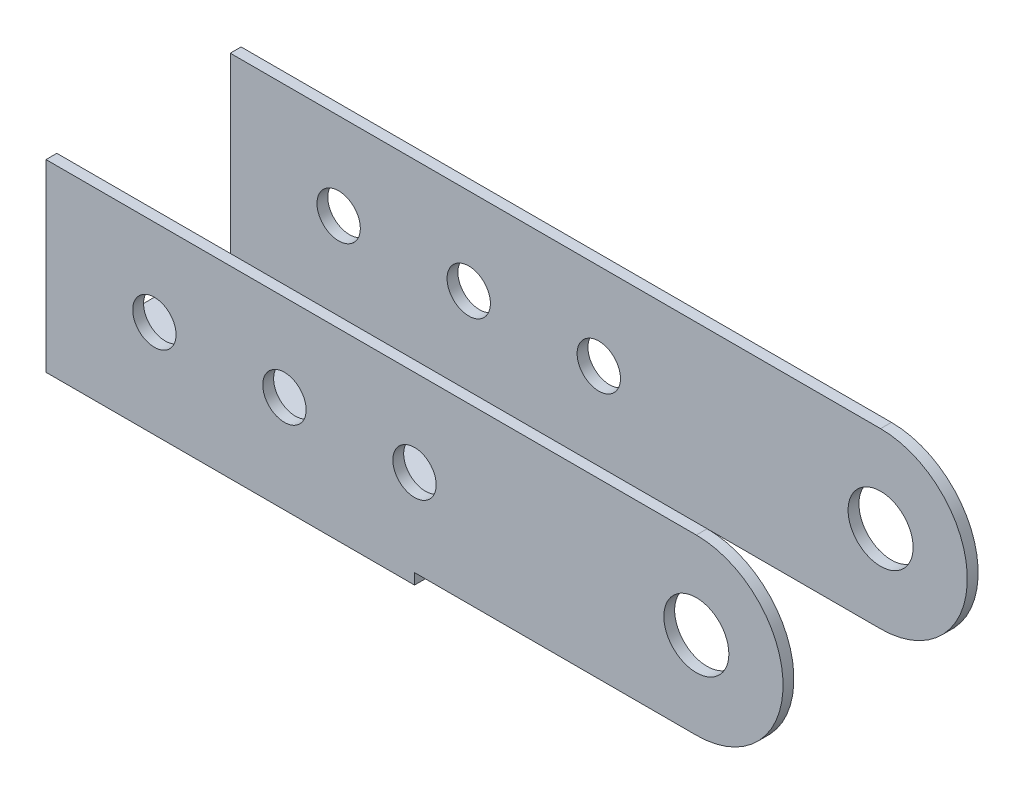
ISO-10303-21;
HEADER;
FILE_DESCRIPTION(('STEP AP214'),'2;1');
FILE_NAME('part.step','',(''),(''),'','','');
FILE_SCHEMA(('AUTOMOTIVE_DESIGN { 1 0 10303 214 1 1 1 1 }'));
ENDSEC;
DATA;
#1=APPLICATION_CONTEXT('core data for automotive mechanical design processes');
#2=APPLICATION_PROTOCOL_DEFINITION('international standard','automotive_design',2000,#1);
#3=PRODUCT_CONTEXT('',#1,'mechanical');
#4=PRODUCT('Part','Part','',(#3));
#5=PRODUCT_RELATED_PRODUCT_CATEGORY('part','',(#4));
#6=PRODUCT_DEFINITION_FORMATION('','',#4);
#7=PRODUCT_DEFINITION_CONTEXT('part definition',#1,'design');
#8=PRODUCT_DEFINITION('design','',#6,#7);
#9=PRODUCT_DEFINITION_SHAPE('','',#8);
#10=(LENGTH_UNIT() NAMED_UNIT(*) SI_UNIT(.MILLI.,.METRE.));
#11=(NAMED_UNIT(*) PLANE_ANGLE_UNIT() SI_UNIT($,.RADIAN.));
#12=(NAMED_UNIT(*) SI_UNIT($,.STERADIAN.) SOLID_ANGLE_UNIT());
#13=UNCERTAINTY_MEASURE_WITH_UNIT(LENGTH_MEASURE(1.E-05),#10,'distance_accuracy_value','');
#14=(GEOMETRIC_REPRESENTATION_CONTEXT(3) GLOBAL_UNCERTAINTY_ASSIGNED_CONTEXT((#13)) GLOBAL_UNIT_ASSIGNED_CONTEXT((#10,
#11,#12)) REPRESENTATION_CONTEXT('',''));
#15=CARTESIAN_POINT('',(0.,0.,0.));
#16=DIRECTION('',(0.,0.,1.));
#17=DIRECTION('',(1.,0.,0.));
#18=AXIS2_PLACEMENT_3D('',#15,#16,#17);
#19=CARTESIAN_POINT('',(-15.,-4.,8.5));
#20=DIRECTION('',(0.,1.,0.));
#21=DIRECTION('',(-1.,0.,0.));
#22=AXIS2_PLACEMENT_3D('',#19,#20,#21);
#23=PLANE('',#22);
#24=DIRECTION('',(0.,0.,1.));
#25=VECTOR('',#24,1.);
#26=CARTESIAN_POINT('',(2.00000000000001,-4.,8.5));
#27=LINE('',#26,#25);
#28=CARTESIAN_POINT('',(2.00000000000001,-4.,8.));
#29=VERTEX_POINT('',#28);
#30=CARTESIAN_POINT('',(2.00000000000001,-4.,8.5));
#31=VERTEX_POINT('',#30);
#32=EDGE_CURVE('E11',#29,#31,#27,.T.);
#33=ORIENTED_EDGE('',*,*,#32,.F.);
#34=DIRECTION('',(1.,0.,0.));
#35=VECTOR('',#34,1.);
#36=CARTESIAN_POINT('',(-15.,-4.,8.));
#37=LINE('',#36,#35);
#38=CARTESIAN_POINT('',(15.,-4.,8.));
#39=VERTEX_POINT('',#38);
#40=EDGE_CURVE('E222',#29,#39,#37,.T.);
#41=ORIENTED_EDGE('',*,*,#40,.T.);
#42=DIRECTION('',(0.,0.,-1.));
#43=VECTOR('',#42,1.);
#44=CARTESIAN_POINT('',(15.,-4.,8.5));
#45=LINE('',#44,#43);
#46=CARTESIAN_POINT('',(15.,-4.,8.5));
#47=VERTEX_POINT('',#46);
#48=EDGE_CURVE('E45',#47,#39,#45,.T.);
#49=ORIENTED_EDGE('',*,*,#48,.F.);
#50=DIRECTION('',(1.,0.,0.));
#51=VECTOR('',#50,1.);
#52=CARTESIAN_POINT('',(-15.,-4.,8.5));
#53=LINE('',#52,#51);
#54=EDGE_CURVE('E52',#31,#47,#53,.T.);
#55=ORIENTED_EDGE('',*,*,#54,.F.);
#56=EDGE_LOOP('',(#33,#41,#49,#55));
#57=FACE_BOUND('',#56,.T.);
#58=ADVANCED_FACE('F37',(#57),#23,.F.);
#59=CARTESIAN_POINT('',(15.,0.,8.5));
#60=DIRECTION('',(0.,0.,1.));
#61=DIRECTION('',(1.,0.,0.));
#62=AXIS2_PLACEMENT_3D('',#59,#60,#61);
#63=PLANE('',#62);
#64=CARTESIAN_POINT('',(-3.99999999999999,0.,8.5));
#65=DIRECTION('',(0.,0.,1.));
#66=DIRECTION('',(1.,0.,0.));
#67=AXIS2_PLACEMENT_3D('',#64,#65,#66);
#68=CIRCLE('',#67,1.);
#69=CARTESIAN_POINT('',(-2.99999999999999,0.,8.5));
#70=VERTEX_POINT('',#69);
#71=EDGE_CURVE('E194',#70,#70,#68,.T.);
#72=ORIENTED_EDGE('',*,*,#71,.F.);
#73=EDGE_LOOP('',(#72));
#74=FACE_BOUND('',#73,.T.);
#75=CARTESIAN_POINT('',(15.,0.,8.5));
#76=DIRECTION('',(0.,0.,1.));
#77=DIRECTION('',(1.,0.,0.));
#78=AXIS2_PLACEMENT_3D('',#75,#76,#77);
#79=CIRCLE('',#78,1.5);
#80=CARTESIAN_POINT('',(16.5,0.,8.5));
#81=VERTEX_POINT('',#80);
#82=EDGE_CURVE('E206',#81,#81,#79,.T.);
#83=ORIENTED_EDGE('',*,*,#82,.F.);
#84=EDGE_LOOP('',(#83));
#85=FACE_BOUND('',#84,.T.);
#86=DIRECTION('',(0.,-1.,0.));
#87=VECTOR('',#86,1.);
#88=CARTESIAN_POINT('',(-15.,4.,8.5));
#89=LINE('',#88,#87);
#90=CARTESIAN_POINT('',(-15.,4.,8.5));
#91=VERTEX_POINT('',#90);
#92=CARTESIAN_POINT('',(-15.,-4.5,8.5));
#93=VERTEX_POINT('',#92);
#94=EDGE_CURVE('E212',#91,#93,#89,.T.);
#95=ORIENTED_EDGE('',*,*,#94,.T.);
#96=DIRECTION('',(-1.,0.,0.));
#97=VECTOR('',#96,1.);
#98=CARTESIAN_POINT('',(-15.,-4.5,8.5));
#99=LINE('',#98,#97);
#100=CARTESIAN_POINT('',(2.00000000000001,-4.5,8.5));
#101=VERTEX_POINT('',#100);
#102=EDGE_CURVE('E168',#101,#93,#99,.T.);
#103=ORIENTED_EDGE('',*,*,#102,.F.);
#104=DIRECTION('',(0.,1.,0.));
#105=VECTOR('',#104,1.);
#106=CARTESIAN_POINT('',(2.00000000000001,-4.5,8.5));
#107=LINE('',#106,#105);
#108=EDGE_CURVE('E184',#101,#31,#107,.T.);
#109=ORIENTED_EDGE('',*,*,#108,.T.);
#110=ORIENTED_EDGE('',*,*,#54,.T.);
#111=CARTESIAN_POINT('',(15.,0.,8.5));
#112=DIRECTION('',(0.,0.,1.));
#113=DIRECTION('',(1.,0.,0.));
#114=AXIS2_PLACEMENT_3D('',#111,#112,#113);
#115=CIRCLE('',#114,4.);
#116=CARTESIAN_POINT('',(15.,4.,8.5));
#117=VERTEX_POINT('',#116);
#118=EDGE_CURVE('E216',#47,#117,#115,.T.);
#119=ORIENTED_EDGE('',*,*,#118,.T.);
#120=DIRECTION('',(-1.,0.,0.));
#121=VECTOR('',#120,1.);
#122=CARTESIAN_POINT('',(15.,4.,8.5));
#123=LINE('',#122,#121);
#124=EDGE_CURVE('E218',#117,#91,#123,.T.);
#125=ORIENTED_EDGE('',*,*,#124,.T.);
#126=EDGE_LOOP('',(#95,#103,#109,#110,#119,#125));
#127=FACE_BOUND('',#126,.T.);
#128=CARTESIAN_POINT('',(2.00000000000001,0.,8.5));
#129=DIRECTION('',(0.,0.,1.));
#130=DIRECTION('',(1.,0.,0.));
#131=AXIS2_PLACEMENT_3D('',#128,#129,#130);
#132=CIRCLE('',#131,1.);
#133=CARTESIAN_POINT('',(3.00000000000001,0.,8.5));
#134=VERTEX_POINT('',#133);
#135=EDGE_CURVE('E200',#134,#134,#132,.T.);
#136=ORIENTED_EDGE('',*,*,#135,.F.);
#137=EDGE_LOOP('',(#136));
#138=FACE_BOUND('',#137,.T.);
#139=CARTESIAN_POINT('',(-9.99999999999999,0.,8.5));
#140=DIRECTION('',(0.,0.,1.));
#141=DIRECTION('',(1.,0.,0.));
#142=AXIS2_PLACEMENT_3D('',#139,#140,#141);
#143=CIRCLE('',#142,1.);
#144=CARTESIAN_POINT('',(-9.,0.,8.5));
#145=VERTEX_POINT('',#144);
#146=EDGE_CURVE('E188',#145,#145,#143,.T.);
#147=ORIENTED_EDGE('',*,*,#146,.F.);
#148=EDGE_LOOP('',(#147));
#149=FACE_BOUND('',#148,.T.);
#150=ADVANCED_FACE('F254',(#74,#85,#127,#138,#149),#63,.T.);
#151=CARTESIAN_POINT('',(15.,0.,8.));
#152=DIRECTION('',(0.,0.,1.));
#153=DIRECTION('',(1.,0.,0.));
#154=AXIS2_PLACEMENT_3D('',#151,#152,#153);
#155=PLANE('',#154);
#156=DIRECTION('',(0.,-1.,0.));
#157=VECTOR('',#156,1.);
#158=CARTESIAN_POINT('',(-15.,4.,8.));
#159=LINE('',#158,#157);
#160=CARTESIAN_POINT('',(-15.,4.,8.));
#161=VERTEX_POINT('',#160);
#162=CARTESIAN_POINT('',(-15.,-4.,8.));
#163=VERTEX_POINT('',#162);
#164=EDGE_CURVE('E209',#161,#163,#159,.T.);
#165=ORIENTED_EDGE('',*,*,#164,.F.);
#166=DIRECTION('',(-1.,0.,0.));
#167=VECTOR('',#166,1.);
#168=CARTESIAN_POINT('',(15.,4.,8.));
#169=LINE('',#168,#167);
#170=CARTESIAN_POINT('',(15.,4.,8.));
#171=VERTEX_POINT('',#170);
#172=EDGE_CURVE('E214',#171,#161,#169,.T.);
#173=ORIENTED_EDGE('',*,*,#172,.F.);
#174=CARTESIAN_POINT('',(15.,0.,8.));
#175=DIRECTION('',(0.,0.,1.));
#176=DIRECTION('',(1.,0.,0.));
#177=AXIS2_PLACEMENT_3D('',#174,#175,#176);
#178=CIRCLE('',#177,4.);
#179=EDGE_CURVE('E226',#39,#171,#178,.T.);
#180=ORIENTED_EDGE('',*,*,#179,.F.);
#181=ORIENTED_EDGE('',*,*,#40,.F.);
#182=EDGE_CURVE('E223',#163,#29,#37,.T.);
#183=ORIENTED_EDGE('',*,*,#182,.F.);
#184=EDGE_LOOP('',(#165,#173,#180,#181,#183));
#185=FACE_BOUND('',#184,.T.);
#186=CARTESIAN_POINT('',(15.,0.,8.));
#187=DIRECTION('',(0.,0.,1.));
#188=DIRECTION('',(1.,0.,0.));
#189=AXIS2_PLACEMENT_3D('',#186,#187,#188);
#190=CIRCLE('',#189,1.5);
#191=CARTESIAN_POINT('',(16.5,0.,8.));
#192=VERTEX_POINT('',#191);
#193=EDGE_CURVE('E203',#192,#192,#190,.T.);
#194=ORIENTED_EDGE('',*,*,#193,.T.);
#195=EDGE_LOOP('',(#194));
#196=FACE_BOUND('',#195,.T.);
#197=CARTESIAN_POINT('',(2.00000000000001,0.,8.));
#198=DIRECTION('',(0.,0.,1.));
#199=DIRECTION('',(1.,0.,0.));
#200=AXIS2_PLACEMENT_3D('',#197,#198,#199);
#201=CIRCLE('',#200,1.);
#202=CARTESIAN_POINT('',(3.00000000000001,0.,8.));
#203=VERTEX_POINT('',#202);
#204=EDGE_CURVE('E197',#203,#203,#201,.T.);
#205=ORIENTED_EDGE('',*,*,#204,.T.);
#206=EDGE_LOOP('',(#205));
#207=FACE_BOUND('',#206,.T.);
#208=CARTESIAN_POINT('',(-3.99999999999999,0.,8.));
#209=DIRECTION('',(0.,0.,1.));
#210=DIRECTION('',(1.,0.,0.));
#211=AXIS2_PLACEMENT_3D('',#208,#209,#210);
#212=CIRCLE('',#211,1.);
#213=CARTESIAN_POINT('',(-2.99999999999999,0.,8.));
#214=VERTEX_POINT('',#213);
#215=EDGE_CURVE('E191',#214,#214,#212,.T.);
#216=ORIENTED_EDGE('',*,*,#215,.T.);
#217=EDGE_LOOP('',(#216));
#218=FACE_BOUND('',#217,.T.);
#219=CARTESIAN_POINT('',(-9.99999999999999,0.,8.));
#220=DIRECTION('',(0.,0.,1.));
#221=DIRECTION('',(1.,0.,0.));
#222=AXIS2_PLACEMENT_3D('',#219,#220,#221);
#223=CIRCLE('',#222,1.);
#224=CARTESIAN_POINT('',(-9.,0.,8.));
#225=VERTEX_POINT('',#224);
#226=EDGE_CURVE('E187',#225,#225,#223,.T.);
#227=ORIENTED_EDGE('',*,*,#226,.T.);
#228=EDGE_LOOP('',(#227));
#229=FACE_BOUND('',#228,.T.);
#230=ADVANCED_FACE('F243',(#185,#196,#207,#218,#229),#155,.F.);
#231=CARTESIAN_POINT('',(-15.,4.,8.5));
#232=DIRECTION('',(1.,0.,0.));
#233=DIRECTION('',(0.,0.,-1.));
#234=AXIS2_PLACEMENT_3D('',#231,#232,#233);
#235=PLANE('',#234);
#236=ORIENTED_EDGE('',*,*,#164,.T.);
#237=DIRECTION('',(0.,0.,-1.));
#238=VECTOR('',#237,1.);
#239=CARTESIAN_POINT('',(-15.,-4.,-0.5));
#240=LINE('',#239,#238);
#241=CARTESIAN_POINT('',(-15.,-4.,0.));
#242=VERTEX_POINT('',#241);
#243=EDGE_CURVE('E169',#163,#242,#240,.T.);
#244=ORIENTED_EDGE('',*,*,#243,.T.);
#245=DIRECTION('',(0.,-1.,0.));
#246=VECTOR('',#245,1.);
#247=CARTESIAN_POINT('',(-15.,4.,0.));
#248=LINE('',#247,#246);
#249=CARTESIAN_POINT('',(-15.,4.,0.));
#250=VERTEX_POINT('',#249);
#251=EDGE_CURVE('E161',#250,#242,#248,.T.);
#252=ORIENTED_EDGE('',*,*,#251,.F.);
#253=DIRECTION('',(0.,0.,1.));
#254=VECTOR('',#253,1.);
#255=CARTESIAN_POINT('',(-15.,4.,-0.5));
#256=LINE('',#255,#254);
#257=CARTESIAN_POINT('',(-15.,4.,-0.5));
#258=VERTEX_POINT('',#257);
#259=EDGE_CURVE('E130',#258,#250,#256,.T.);
#260=ORIENTED_EDGE('',*,*,#259,.F.);
#261=DIRECTION('',(0.,1.,0.));
#262=VECTOR('',#261,1.);
#263=CARTESIAN_POINT('',(-15.,-4.5,-0.5));
#264=LINE('',#263,#262);
#265=CARTESIAN_POINT('',(-15.,-4.5,-0.5));
#266=VERTEX_POINT('',#265);
#267=EDGE_CURVE('E140',#266,#258,#264,.T.);
#268=ORIENTED_EDGE('',*,*,#267,.F.);
#269=DIRECTION('',(0.,0.,-1.));
#270=VECTOR('',#269,1.);
#271=CARTESIAN_POINT('',(-15.,-4.5,-0.5));
#272=LINE('',#271,#270);
#273=EDGE_CURVE('E172',#93,#266,#272,.T.);
#274=ORIENTED_EDGE('',*,*,#273,.F.);
#275=ORIENTED_EDGE('',*,*,#94,.F.);
#276=DIRECTION('',(0.,0.,-1.));
#277=VECTOR('',#276,1.);
#278=CARTESIAN_POINT('',(-15.,4.,8.5));
#279=LINE('',#278,#277);
#280=EDGE_CURVE('E220',#91,#161,#279,.T.);
#281=ORIENTED_EDGE('',*,*,#280,.T.);
#282=EDGE_LOOP('',(#236,#244,#252,#260,#268,#274,#275,#281));
#283=FACE_BOUND('',#282,.T.);
#284=ADVANCED_FACE('F39',(#283),#235,.F.);
#285=CARTESIAN_POINT('',(15.,0.,8.5));
#286=DIRECTION('',(0.,0.,-1.));
#287=DIRECTION('',(-1.,0.,0.));
#288=AXIS2_PLACEMENT_3D('',#285,#286,#287);
#289=CYLINDRICAL_SURFACE('',#288,4.);
#290=ORIENTED_EDGE('',*,*,#179,.T.);
#291=DIRECTION('',(0.,0.,-1.));
#292=VECTOR('',#291,1.);
#293=CARTESIAN_POINT('',(15.,4.,8.5));
#294=LINE('',#293,#292);
#295=EDGE_CURVE('E231',#117,#171,#294,.T.);
#296=ORIENTED_EDGE('',*,*,#295,.F.);
#297=ORIENTED_EDGE('',*,*,#118,.F.);
#298=ORIENTED_EDGE('',*,*,#48,.T.);
#299=EDGE_LOOP('',(#290,#296,#297,#298));
#300=FACE_BOUND('',#299,.T.);
#301=ADVANCED_FACE('F237',(#300),#289,.T.);
#302=CARTESIAN_POINT('',(15.,4.,8.5));
#303=DIRECTION('',(0.,-1.,0.));
#304=DIRECTION('',(0.,0.,-1.));
#305=AXIS2_PLACEMENT_3D('',#302,#303,#304);
#306=PLANE('',#305);
#307=ORIENTED_EDGE('',*,*,#172,.T.);
#308=ORIENTED_EDGE('',*,*,#280,.F.);
#309=ORIENTED_EDGE('',*,*,#124,.F.);
#310=ORIENTED_EDGE('',*,*,#295,.T.);
#311=EDGE_LOOP('',(#307,#308,#309,#310));
#312=FACE_BOUND('',#311,.T.);
#313=ADVANCED_FACE('F248',(#312),#306,.F.);
#314=CARTESIAN_POINT('',(15.,0.,8.5));
#315=DIRECTION('',(0.,0.,-1.));
#316=DIRECTION('',(-1.,0.,0.));
#317=AXIS2_PLACEMENT_3D('',#314,#315,#316);
#318=CYLINDRICAL_SURFACE('',#317,1.5);
#319=ORIENTED_EDGE('',*,*,#82,.T.);
#320=EDGE_LOOP('',(#319));
#321=FACE_BOUND('',#320,.T.);
#322=ORIENTED_EDGE('',*,*,#193,.F.);
#323=EDGE_LOOP('',(#322));
#324=FACE_BOUND('',#323,.T.);
#325=ADVANCED_FACE('F273',(#321,#324),#318,.F.);
#326=CARTESIAN_POINT('',(2.00000000000001,0.,8.5));
#327=DIRECTION('',(0.,0.,-1.));
#328=DIRECTION('',(-1.,0.,0.));
#329=AXIS2_PLACEMENT_3D('',#326,#327,#328);
#330=CYLINDRICAL_SURFACE('',#329,1.);
#331=ORIENTED_EDGE('',*,*,#135,.T.);
#332=EDGE_LOOP('',(#331));
#333=FACE_BOUND('',#332,.T.);
#334=ORIENTED_EDGE('',*,*,#204,.F.);
#335=EDGE_LOOP('',(#334));
#336=FACE_BOUND('',#335,.T.);
#337=ADVANCED_FACE('F278',(#333,#336),#330,.F.);
#338=CARTESIAN_POINT('',(-3.99999999999999,0.,8.5));
#339=DIRECTION('',(0.,0.,-1.));
#340=DIRECTION('',(-1.,0.,0.));
#341=AXIS2_PLACEMENT_3D('',#338,#339,#340);
#342=CYLINDRICAL_SURFACE('',#341,1.);
#343=ORIENTED_EDGE('',*,*,#71,.T.);
#344=EDGE_LOOP('',(#343));
#345=FACE_BOUND('',#344,.T.);
#346=ORIENTED_EDGE('',*,*,#215,.F.);
#347=EDGE_LOOP('',(#346));
#348=FACE_BOUND('',#347,.T.);
#349=ADVANCED_FACE('F282',(#345,#348),#342,.F.);
#350=CARTESIAN_POINT('',(-9.99999999999999,0.,8.5));
#351=DIRECTION('',(0.,0.,-1.));
#352=DIRECTION('',(-1.,0.,0.));
#353=AXIS2_PLACEMENT_3D('',#350,#351,#352);
#354=CYLINDRICAL_SURFACE('',#353,1.);
#355=ORIENTED_EDGE('',*,*,#146,.T.);
#356=EDGE_LOOP('',(#355));
#357=FACE_BOUND('',#356,.T.);
#358=ORIENTED_EDGE('',*,*,#226,.F.);
#359=EDGE_LOOP('',(#358));
#360=FACE_BOUND('',#359,.T.);
#361=ADVANCED_FACE('F286',(#357,#360),#354,.F.);
#362=CARTESIAN_POINT('',(0.,-4.,0.));
#363=DIRECTION('',(0.,1.,0.));
#364=DIRECTION('',(0.,0.,1.));
#365=AXIS2_PLACEMENT_3D('',#362,#363,#364);
#366=PLANE('',#365);
#367=DIRECTION('',(1.,0.,0.));
#368=VECTOR('',#367,1.);
#369=CARTESIAN_POINT('',(-15.,-4.,0.));
#370=LINE('',#369,#368);
#371=CARTESIAN_POINT('',(2.00000000000001,-4.,0.));
#372=VERTEX_POINT('',#371);
#373=EDGE_CURVE('E147',#242,#372,#370,.T.);
#374=ORIENTED_EDGE('',*,*,#373,.F.);
#375=ORIENTED_EDGE('',*,*,#243,.F.);
#376=ORIENTED_EDGE('',*,*,#182,.T.);
#377=DIRECTION('',(0.,0.,1.));
#378=VECTOR('',#377,1.);
#379=CARTESIAN_POINT('',(2.00000000000001,-4.,8.5));
#380=LINE('',#379,#378);
#381=EDGE_CURVE('E58',#372,#29,#380,.T.);
#382=ORIENTED_EDGE('',*,*,#381,.F.);
#383=EDGE_LOOP('',(#374,#375,#376,#382));
#384=FACE_BOUND('',#383,.T.);
#385=ADVANCED_FACE('F290',(#384),#366,.T.);
#386=CARTESIAN_POINT('',(2.00000000000001,-4.5,8.5));
#387=DIRECTION('',(-1.,0.,0.));
#388=DIRECTION('',(0.,0.,1.));
#389=AXIS2_PLACEMENT_3D('',#386,#387,#388);
#390=PLANE('',#389);
#391=CARTESIAN_POINT('',(2.00000000000001,-4.,-0.5));
#392=VERTEX_POINT('',#391);
#393=EDGE_CURVE('E177',#392,#372,#380,.T.);
#394=ORIENTED_EDGE('',*,*,#393,.T.);
#395=ORIENTED_EDGE('',*,*,#381,.T.);
#396=ORIENTED_EDGE('',*,*,#32,.T.);
#397=ORIENTED_EDGE('',*,*,#108,.F.);
#398=DIRECTION('',(0.,0.,1.));
#399=VECTOR('',#398,1.);
#400=CARTESIAN_POINT('',(2.00000000000001,-4.5,8.5));
#401=LINE('',#400,#399);
#402=CARTESIAN_POINT('',(2.00000000000001,-4.5,-0.5));
#403=VERTEX_POINT('',#402);
#404=EDGE_CURVE('E165',#403,#101,#401,.T.);
#405=ORIENTED_EDGE('',*,*,#404,.F.);
#406=DIRECTION('',(0.,1.,0.));
#407=VECTOR('',#406,1.);
#408=CARTESIAN_POINT('',(2.00000000000001,-4.5,-0.5));
#409=LINE('',#408,#407);
#410=EDGE_CURVE('E176',#403,#392,#409,.T.);
#411=ORIENTED_EDGE('',*,*,#410,.T.);
#412=EDGE_LOOP('',(#394,#395,#396,#397,#405,#411));
#413=FACE_BOUND('',#412,.T.);
#414=ADVANCED_FACE('F261',(#413),#390,.F.);
#415=CARTESIAN_POINT('',(2.00000000000001,-4.5,-0.5));
#416=DIRECTION('',(0.,0.,1.));
#417=DIRECTION('',(1.,0.,0.));
#418=AXIS2_PLACEMENT_3D('',#415,#416,#417);
#419=PLANE('',#418);
#420=ORIENTED_EDGE('',*,*,#267,.T.);
#421=DIRECTION('',(-1.,0.,0.));
#422=VECTOR('',#421,1.);
#423=CARTESIAN_POINT('',(-15.,4.,-0.5));
#424=LINE('',#423,#422);
#425=CARTESIAN_POINT('',(15.,4.,-0.5));
#426=VERTEX_POINT('',#425);
#427=EDGE_CURVE('E123',#426,#258,#424,.T.);
#428=ORIENTED_EDGE('',*,*,#427,.F.);
#429=CARTESIAN_POINT('',(15.,0.,-0.5));
#430=DIRECTION('',(0.,0.,1.));
#431=DIRECTION('',(1.,0.,0.));
#432=AXIS2_PLACEMENT_3D('',#429,#430,#431);
#433=CIRCLE('',#432,4.);
#434=CARTESIAN_POINT('',(15.,-4.,-0.5));
#435=VERTEX_POINT('',#434);
#436=EDGE_CURVE('E137',#435,#426,#433,.T.);
#437=ORIENTED_EDGE('',*,*,#436,.F.);
#438=DIRECTION('',(1.,0.,0.));
#439=VECTOR('',#438,1.);
#440=CARTESIAN_POINT('',(-15.,-4.,-0.5));
#441=LINE('',#440,#439);
#442=EDGE_CURVE('E131',#392,#435,#441,.T.);
#443=ORIENTED_EDGE('',*,*,#442,.F.);
#444=ORIENTED_EDGE('',*,*,#410,.F.);
#445=DIRECTION('',(1.,0.,0.));
#446=VECTOR('',#445,1.);
#447=CARTESIAN_POINT('',(2.00000000000001,-4.5,-0.5));
#448=LINE('',#447,#446);
#449=EDGE_CURVE('E174',#266,#403,#448,.T.);
#450=ORIENTED_EDGE('',*,*,#449,.F.);
#451=EDGE_LOOP('',(#420,#428,#437,#443,#444,#450));
#452=FACE_BOUND('',#451,.T.);
#453=CARTESIAN_POINT('',(2.00000000000001,0.,-0.5));
#454=DIRECTION('',(0.,0.,1.));
#455=DIRECTION('',(1.,0.,0.));
#456=AXIS2_PLACEMENT_3D('',#453,#454,#455);
#457=CIRCLE('',#456,1.);
#458=CARTESIAN_POINT('',(3.00000000000001,0.,-0.5));
#459=VERTEX_POINT('',#458);
#460=EDGE_CURVE('E333',#459,#459,#457,.T.);
#461=ORIENTED_EDGE('',*,*,#460,.T.);
#462=EDGE_LOOP('',(#461));
#463=FACE_BOUND('',#462,.T.);
#464=CARTESIAN_POINT('',(-3.99999999999999,0.,-0.5));
#465=DIRECTION('',(0.,0.,1.));
#466=DIRECTION('',(1.,0.,0.));
#467=AXIS2_PLACEMENT_3D('',#464,#465,#466);
#468=CIRCLE('',#467,1.);
#469=CARTESIAN_POINT('',(-2.99999999999999,0.,-0.5));
#470=VERTEX_POINT('',#469);
#471=EDGE_CURVE('E341',#470,#470,#468,.T.);
#472=ORIENTED_EDGE('',*,*,#471,.T.);
#473=EDGE_LOOP('',(#472));
#474=FACE_BOUND('',#473,.T.);
#475=CARTESIAN_POINT('',(-9.99999999999999,0.,-0.5));
#476=DIRECTION('',(0.,0.,1.));
#477=DIRECTION('',(1.,0.,0.));
#478=AXIS2_PLACEMENT_3D('',#475,#476,#477);
#479=CIRCLE('',#478,1.);
#480=CARTESIAN_POINT('',(-9.,0.,-0.5));
#481=VERTEX_POINT('',#480);
#482=EDGE_CURVE('E347',#481,#481,#479,.T.);
#483=ORIENTED_EDGE('',*,*,#482,.T.);
#484=EDGE_LOOP('',(#483));
#485=FACE_BOUND('',#484,.T.);
#486=CARTESIAN_POINT('',(15.,0.,-0.5));
#487=DIRECTION('',(0.,0.,1.));
#488=DIRECTION('',(1.,0.,0.));
#489=AXIS2_PLACEMENT_3D('',#486,#487,#488);
#490=CIRCLE('',#489,1.5);
#491=CARTESIAN_POINT('',(16.5,0.,-0.5));
#492=VERTEX_POINT('',#491);
#493=EDGE_CURVE('E159',#492,#492,#490,.T.);
#494=ORIENTED_EDGE('',*,*,#493,.T.);
#495=EDGE_LOOP('',(#494));
#496=FACE_BOUND('',#495,.T.);
#497=ADVANCED_FACE('F135',(#452,#463,#474,#485,#496),#419,.F.);
#498=CARTESIAN_POINT('',(0.,-4.5,0.));
#499=DIRECTION('',(0.,1.,0.));
#500=DIRECTION('',(0.,0.,1.));
#501=AXIS2_PLACEMENT_3D('',#498,#499,#500);
#502=PLANE('',#501);
#503=ORIENTED_EDGE('',*,*,#404,.T.);
#504=ORIENTED_EDGE('',*,*,#102,.T.);
#505=ORIENTED_EDGE('',*,*,#273,.T.);
#506=ORIENTED_EDGE('',*,*,#449,.T.);
#507=EDGE_LOOP('',(#503,#504,#505,#506));
#508=FACE_BOUND('',#507,.T.);
#509=ADVANCED_FACE('F257',(#508),#502,.F.);
#510=CARTESIAN_POINT('',(-15.,-4.,-0.5));
#511=DIRECTION('',(0.,-1.,0.));
#512=DIRECTION('',(0.,0.,-1.));
#513=AXIS2_PLACEMENT_3D('',#510,#511,#512);
#514=PLANE('',#513);
#515=ORIENTED_EDGE('',*,*,#393,.F.);
#516=ORIENTED_EDGE('',*,*,#442,.T.);
#517=DIRECTION('',(0.,0.,1.));
#518=VECTOR('',#517,1.);
#519=CARTESIAN_POINT('',(15.,-4.,-0.5));
#520=LINE('',#519,#518);
#521=CARTESIAN_POINT('',(15.,-4.,0.));
#522=VERTEX_POINT('',#521);
#523=EDGE_CURVE('E146',#435,#522,#520,.T.);
#524=ORIENTED_EDGE('',*,*,#523,.T.);
#525=EDGE_CURVE('E150',#372,#522,#370,.T.);
#526=ORIENTED_EDGE('',*,*,#525,.F.);
#527=EDGE_LOOP('',(#515,#516,#524,#526));
#528=FACE_BOUND('',#527,.T.);
#529=ADVANCED_FACE('F301',(#528),#514,.T.);
#530=CARTESIAN_POINT('',(15.,0.,-0.5));
#531=DIRECTION('',(0.,0.,1.));
#532=DIRECTION('',(1.,0.,0.));
#533=AXIS2_PLACEMENT_3D('',#530,#531,#532);
#534=CYLINDRICAL_SURFACE('',#533,4.);
#535=CARTESIAN_POINT('',(15.,0.,0.));
#536=DIRECTION('',(0.,0.,1.));
#537=DIRECTION('',(1.,0.,0.));
#538=AXIS2_PLACEMENT_3D('',#535,#536,#537);
#539=CIRCLE('',#538,4.);
#540=CARTESIAN_POINT('',(15.,4.,0.));
#541=VERTEX_POINT('',#540);
#542=EDGE_CURVE('E157',#522,#541,#539,.T.);
#543=ORIENTED_EDGE('',*,*,#542,.F.);
#544=ORIENTED_EDGE('',*,*,#523,.F.);
#545=ORIENTED_EDGE('',*,*,#436,.T.);
#546=DIRECTION('',(0.,0.,1.));
#547=VECTOR('',#546,1.);
#548=CARTESIAN_POINT('',(15.,4.,-0.5));
#549=LINE('',#548,#547);
#550=EDGE_CURVE('E120',#426,#541,#549,.T.);
#551=ORIENTED_EDGE('',*,*,#550,.T.);
#552=EDGE_LOOP('',(#543,#544,#545,#551));
#553=FACE_BOUND('',#552,.T.);
#554=ADVANCED_FACE('F144',(#553),#534,.T.);
#555=CARTESIAN_POINT('',(-15.,4.,-0.5));
#556=DIRECTION('',(0.,1.,0.));
#557=DIRECTION('',(0.,0.,1.));
#558=AXIS2_PLACEMENT_3D('',#555,#556,#557);
#559=PLANE('',#558);
#560=DIRECTION('',(-1.,0.,0.));
#561=VECTOR('',#560,1.);
#562=CARTESIAN_POINT('',(-15.,4.,0.));
#563=LINE('',#562,#561);
#564=EDGE_CURVE('E125',#541,#250,#563,.T.);
#565=ORIENTED_EDGE('',*,*,#564,.F.);
#566=ORIENTED_EDGE('',*,*,#550,.F.);
#567=ORIENTED_EDGE('',*,*,#427,.T.);
#568=ORIENTED_EDGE('',*,*,#259,.T.);
#569=EDGE_LOOP('',(#565,#566,#567,#568));
#570=FACE_BOUND('',#569,.T.);
#571=ADVANCED_FACE('F122',(#570),#559,.T.);
#572=CARTESIAN_POINT('',(15.,0.,0.));
#573=DIRECTION('',(0.,0.,1.));
#574=DIRECTION('',(1.,0.,0.));
#575=AXIS2_PLACEMENT_3D('',#572,#573,#574);
#576=PLANE('',#575);
#577=CARTESIAN_POINT('',(2.00000000000001,0.,0.));
#578=DIRECTION('',(0.,0.,1.));
#579=DIRECTION('',(1.,0.,0.));
#580=AXIS2_PLACEMENT_3D('',#577,#578,#579);
#581=CIRCLE('',#580,1.);
#582=CARTESIAN_POINT('',(3.00000000000001,0.,0.));
#583=VERTEX_POINT('',#582);
#584=EDGE_CURVE('E336',#583,#583,#581,.T.);
#585=ORIENTED_EDGE('',*,*,#584,.F.);
#586=EDGE_LOOP('',(#585));
#587=FACE_BOUND('',#586,.T.);
#588=CARTESIAN_POINT('',(-3.99999999999999,0.,0.));
#589=DIRECTION('',(0.,0.,1.));
#590=DIRECTION('',(1.,0.,0.));
#591=AXIS2_PLACEMENT_3D('',#588,#589,#590);
#592=CIRCLE('',#591,1.);
#593=CARTESIAN_POINT('',(-2.99999999999999,0.,0.));
#594=VERTEX_POINT('',#593);
#595=EDGE_CURVE('E338',#594,#594,#592,.T.);
#596=ORIENTED_EDGE('',*,*,#595,.F.);
#597=EDGE_LOOP('',(#596));
#598=FACE_BOUND('',#597,.T.);
#599=CARTESIAN_POINT('',(-9.99999999999999,0.,0.));
#600=DIRECTION('',(0.,0.,1.));
#601=DIRECTION('',(1.,0.,0.));
#602=AXIS2_PLACEMENT_3D('',#599,#600,#601);
#603=CIRCLE('',#602,1.);
#604=CARTESIAN_POINT('',(-9.,0.,0.));
#605=VERTEX_POINT('',#604);
#606=EDGE_CURVE('E344',#605,#605,#603,.T.);
#607=ORIENTED_EDGE('',*,*,#606,.F.);
#608=EDGE_LOOP('',(#607));
#609=FACE_BOUND('',#608,.T.);
#610=CARTESIAN_POINT('',(15.,0.,0.));
#611=DIRECTION('',(0.,0.,1.));
#612=DIRECTION('',(1.,0.,0.));
#613=AXIS2_PLACEMENT_3D('',#610,#611,#612);
#614=CIRCLE('',#613,1.5);
#615=CARTESIAN_POINT('',(16.5,0.,0.));
#616=VERTEX_POINT('',#615);
#617=EDGE_CURVE('E153',#616,#616,#614,.T.);
#618=ORIENTED_EDGE('',*,*,#617,.F.);
#619=EDGE_LOOP('',(#618));
#620=FACE_BOUND('',#619,.T.);
#621=ORIENTED_EDGE('',*,*,#542,.T.);
#622=ORIENTED_EDGE('',*,*,#564,.T.);
#623=ORIENTED_EDGE('',*,*,#251,.T.);
#624=ORIENTED_EDGE('',*,*,#373,.T.);
#625=ORIENTED_EDGE('',*,*,#525,.T.);
#626=EDGE_LOOP('',(#621,#622,#623,#624,#625));
#627=FACE_BOUND('',#626,.T.);
#628=ADVANCED_FACE('F306',(#587,#598,#609,#620,#627),#576,.T.);
#629=CARTESIAN_POINT('',(15.,0.,-0.5));
#630=DIRECTION('',(0.,0.,1.));
#631=DIRECTION('',(1.,0.,0.));
#632=AXIS2_PLACEMENT_3D('',#629,#630,#631);
#633=CYLINDRICAL_SURFACE('',#632,1.5);
#634=ORIENTED_EDGE('',*,*,#493,.F.);
#635=EDGE_LOOP('',(#634));
#636=FACE_BOUND('',#635,.T.);
#637=ORIENTED_EDGE('',*,*,#617,.T.);
#638=EDGE_LOOP('',(#637));
#639=FACE_BOUND('',#638,.T.);
#640=ADVANCED_FACE('F312',(#636,#639),#633,.F.);
#641=CARTESIAN_POINT('',(-9.99999999999999,0.,-0.5));
#642=DIRECTION('',(0.,0.,1.));
#643=DIRECTION('',(1.,0.,0.));
#644=AXIS2_PLACEMENT_3D('',#641,#642,#643);
#645=CYLINDRICAL_SURFACE('',#644,1.);
#646=ORIENTED_EDGE('',*,*,#482,.F.);
#647=EDGE_LOOP('',(#646));
#648=FACE_BOUND('',#647,.T.);
#649=ORIENTED_EDGE('',*,*,#606,.T.);
#650=EDGE_LOOP('',(#649));
#651=FACE_BOUND('',#650,.T.);
#652=ADVANCED_FACE('F316',(#648,#651),#645,.F.);
#653=CARTESIAN_POINT('',(-3.99999999999999,0.,-0.5));
#654=DIRECTION('',(0.,0.,1.));
#655=DIRECTION('',(1.,0.,0.));
#656=AXIS2_PLACEMENT_3D('',#653,#654,#655);
#657=CYLINDRICAL_SURFACE('',#656,1.);
#658=ORIENTED_EDGE('',*,*,#471,.F.);
#659=EDGE_LOOP('',(#658));
#660=FACE_BOUND('',#659,.T.);
#661=ORIENTED_EDGE('',*,*,#595,.T.);
#662=EDGE_LOOP('',(#661));
#663=FACE_BOUND('',#662,.T.);
#664=ADVANCED_FACE('F320',(#660,#663),#657,.F.);
#665=CARTESIAN_POINT('',(2.00000000000001,0.,-0.5));
#666=DIRECTION('',(0.,0.,1.));
#667=DIRECTION('',(1.,0.,0.));
#668=AXIS2_PLACEMENT_3D('',#665,#666,#667);
#669=CYLINDRICAL_SURFACE('',#668,1.);
#670=ORIENTED_EDGE('',*,*,#460,.F.);
#671=EDGE_LOOP('',(#670));
#672=FACE_BOUND('',#671,.T.);
#673=ORIENTED_EDGE('',*,*,#584,.T.);
#674=EDGE_LOOP('',(#673));
#675=FACE_BOUND('',#674,.T.);
#676=ADVANCED_FACE('F324',(#672,#675),#669,.F.);
#677=CLOSED_SHELL('',(#58,#150,#230,#284,#301,#313,#325,#337,#349,#361,#385,#414,#497,#509,#529,
#554,#571,#628,#640,#652,#664,#676));
#678=MANIFOLD_SOLID_BREP('B2',#677);
#679=ADVANCED_BREP_SHAPE_REPRESENTATION('',(#18,#678),#14);
#680=SHAPE_DEFINITION_REPRESENTATION(#9,#679);
ENDSEC;
END-ISO-10303-21;
